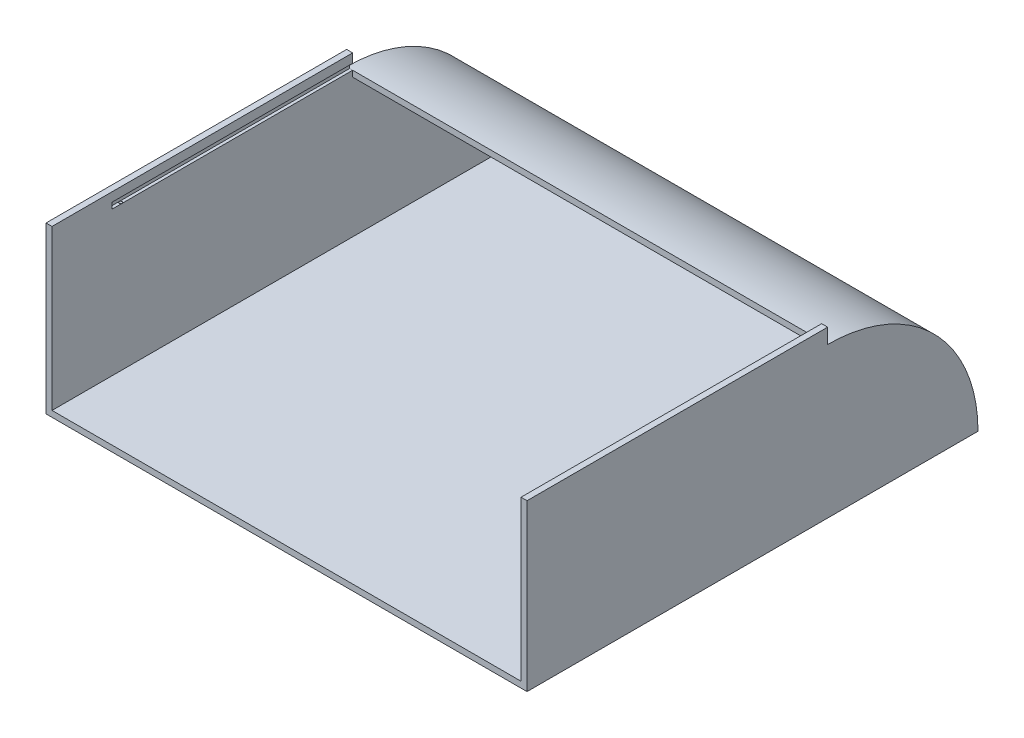
ISO-10303-21;
HEADER;
FILE_DESCRIPTION(('STEP AP214'),'2;1');
FILE_NAME('part.step','',(''),(''),'','','');
FILE_SCHEMA(('AUTOMOTIVE_DESIGN { 1 0 10303 214 1 1 1 1 }'));
ENDSEC;
DATA;
#1=APPLICATION_CONTEXT('core data for automotive mechanical design processes');
#2=APPLICATION_PROTOCOL_DEFINITION('international standard','automotive_design',2000,#1);
#3=PRODUCT_CONTEXT('',#1,'mechanical');
#4=PRODUCT('Part','Part','',(#3));
#5=PRODUCT_RELATED_PRODUCT_CATEGORY('part','',(#4));
#6=PRODUCT_DEFINITION_FORMATION('','',#4);
#7=PRODUCT_DEFINITION_CONTEXT('part definition',#1,'design');
#8=PRODUCT_DEFINITION('design','',#6,#7);
#9=PRODUCT_DEFINITION_SHAPE('','',#8);
#10=(LENGTH_UNIT() NAMED_UNIT(*) SI_UNIT(.MILLI.,.METRE.));
#11=(NAMED_UNIT(*) PLANE_ANGLE_UNIT() SI_UNIT($,.RADIAN.));
#12=(NAMED_UNIT(*) SI_UNIT($,.STERADIAN.) SOLID_ANGLE_UNIT());
#13=UNCERTAINTY_MEASURE_WITH_UNIT(LENGTH_MEASURE(1.E-05),#10,'distance_accuracy_value','');
#14=(GEOMETRIC_REPRESENTATION_CONTEXT(3) GLOBAL_UNCERTAINTY_ASSIGNED_CONTEXT((#13)) GLOBAL_UNIT_ASSIGNED_CONTEXT((#10,
#11,#12)) REPRESENTATION_CONTEXT('',''));
#15=CARTESIAN_POINT('',(0.,0.,0.));
#16=DIRECTION('',(0.,0.,1.));
#17=DIRECTION('',(1.,0.,0.));
#18=AXIS2_PLACEMENT_3D('',#15,#16,#17);
#19=CARTESIAN_POINT('',(-159.,25.,-25.));
#20=DIRECTION('',(0.,-1.,0.));
#21=DIRECTION('',(0.,0.,-1.));
#22=AXIS2_PLACEMENT_3D('',#19,#20,#21);
#23=PLANE('',#22);
#24=CARTESIAN_POINT('',(-158.5,25.,51.6763529111586));
#25=DIRECTION('',(0.,-1.,0.));
#26=DIRECTION('',(0.,0.,-1.));
#27=AXIS2_PLACEMENT_3D('',#24,#25,#26);
#28=CIRCLE('',#27,0.5);
#29=CARTESIAN_POINT('',(-159.,25.,51.6763529111586));
#30=VERTEX_POINT('',#29);
#31=CARTESIAN_POINT('',(-158.,25.,51.6763529111586));
#32=VERTEX_POINT('',#31);
#33=EDGE_CURVE('E11',#30,#32,#28,.F.);
#34=ORIENTED_EDGE('',*,*,#33,.F.);
#35=DIRECTION('',(0.,0.,-1.));
#36=VECTOR('',#35,1.);
#37=CARTESIAN_POINT('',(-159.,25.,-25.));
#38=LINE('',#37,#36);
#39=CARTESIAN_POINT('',(-159.,25.,55.));
#40=VERTEX_POINT('',#39);
#41=EDGE_CURVE('E173',#40,#30,#38,.T.);
#42=ORIENTED_EDGE('',*,*,#41,.F.);
#43=DIRECTION('',(1.,0.,0.));
#44=VECTOR('',#43,1.);
#45=CARTESIAN_POINT('',(-159.,25.,55.));
#46=LINE('',#45,#44);
#47=CARTESIAN_POINT('',(-158.,25.,55.));
#48=VERTEX_POINT('',#47);
#49=EDGE_CURVE('E206',#40,#48,#46,.T.);
#50=ORIENTED_EDGE('',*,*,#49,.T.);
#51=DIRECTION('',(0.,0.,-1.));
#52=VECTOR('',#51,1.);
#53=CARTESIAN_POINT('',(-158.,25.,-25.));
#54=LINE('',#53,#52);
#55=EDGE_CURVE('E175',#48,#32,#54,.T.);
#56=ORIENTED_EDGE('',*,*,#55,.T.);
#57=EDGE_LOOP('',(#34,#42,#50,#56));
#58=FACE_BOUND('',#57,.T.);
#59=ADVANCED_FACE('F33',(#58),#23,.F.);
#60=CARTESIAN_POINT('',(-1.,25.,-25.));
#61=DIRECTION('',(0.,-1.,0.));
#62=DIRECTION('',(0.,0.,-1.));
#63=AXIS2_PLACEMENT_3D('',#60,#61,#62);
#64=PLANE('',#63);
#65=DIRECTION('',(0.,0.,1.));
#66=VECTOR('',#65,1.);
#67=CARTESIAN_POINT('',(-1.,25.,-25.));
#68=LINE('',#67,#66);
#69=CARTESIAN_POINT('',(-1.,25.,50.));
#70=VERTEX_POINT('',#69);
#71=CARTESIAN_POINT('',(-1.,25.,55.));
#72=VERTEX_POINT('',#71);
#73=EDGE_CURVE('E308',#70,#72,#68,.T.);
#74=ORIENTED_EDGE('',*,*,#73,.F.);
#75=CARTESIAN_POINT('',(-1.5,25.,50.));
#76=DIRECTION('',(0.,-1.,0.));
#77=DIRECTION('',(0.,0.,-1.));
#78=AXIS2_PLACEMENT_3D('',#75,#76,#77);
#79=CIRCLE('',#78,0.500000000000002);
#80=CARTESIAN_POINT('',(-2.,25.,50.));
#81=VERTEX_POINT('',#80);
#82=EDGE_CURVE('E52',#70,#81,#79,.T.);
#83=ORIENTED_EDGE('',*,*,#82,.T.);
#84=DIRECTION('',(0.,0.,1.));
#85=VECTOR('',#84,1.);
#86=CARTESIAN_POINT('',(-2.,25.,-25.));
#87=LINE('',#86,#85);
#88=CARTESIAN_POINT('',(-2.,25.,55.));
#89=VERTEX_POINT('',#88);
#90=EDGE_CURVE('E306',#81,#89,#87,.T.);
#91=ORIENTED_EDGE('',*,*,#90,.T.);
#92=DIRECTION('',(-1.,0.,0.));
#93=VECTOR('',#92,1.);
#94=CARTESIAN_POINT('',(-1.,25.,55.));
#95=LINE('',#94,#93);
#96=EDGE_CURVE('E334',#72,#89,#95,.T.);
#97=ORIENTED_EDGE('',*,*,#96,.F.);
#98=EDGE_LOOP('',(#74,#83,#91,#97));
#99=FACE_BOUND('',#98,.T.);
#100=ADVANCED_FACE('F304',(#99),#64,.F.);
#101=CARTESIAN_POINT('',(-160.,-25.,75.));
#102=DIRECTION('',(0.,0.,1.));
#103=DIRECTION('',(1.,0.,0.));
#104=AXIS2_PLACEMENT_3D('',#101,#102,#103);
#105=PLANE('',#104);
#106=DIRECTION('',(0.,-1.,0.));
#107=VECTOR('',#106,1.);
#108=CARTESIAN_POINT('',(0.,-25.,75.));
#109=LINE('',#108,#107);
#110=CARTESIAN_POINT('',(0.,30.,75.));
#111=VERTEX_POINT('',#110);
#112=CARTESIAN_POINT('',(0.,-25.,75.));
#113=VERTEX_POINT('',#112);
#114=EDGE_CURVE('E256',#111,#113,#109,.T.);
#115=ORIENTED_EDGE('',*,*,#114,.F.);
#116=DIRECTION('',(1.,0.,0.));
#117=VECTOR('',#116,1.);
#118=CARTESIAN_POINT('',(-2.,30.,75.));
#119=LINE('',#118,#117);
#120=CARTESIAN_POINT('',(-2.,30.,75.));
#121=VERTEX_POINT('',#120);
#122=EDGE_CURVE('E212',#121,#111,#119,.T.);
#123=ORIENTED_EDGE('',*,*,#122,.F.);
#124=DIRECTION('',(0.,-1.,0.));
#125=VECTOR('',#124,1.);
#126=CARTESIAN_POINT('',(-2.,0.,75.));
#127=LINE('',#126,#125);
#128=CARTESIAN_POINT('',(-2.,-23.,75.));
#129=VERTEX_POINT('',#128);
#130=EDGE_CURVE('E247',#121,#129,#127,.T.);
#131=ORIENTED_EDGE('',*,*,#130,.T.);
#132=DIRECTION('',(1.,0.,0.));
#133=VECTOR('',#132,1.);
#134=CARTESIAN_POINT('',(-160.,-23.,75.));
#135=LINE('',#134,#133);
#136=CARTESIAN_POINT('',(-158.,-23.,75.));
#137=VERTEX_POINT('',#136);
#138=EDGE_CURVE('E260',#137,#129,#135,.T.);
#139=ORIENTED_EDGE('',*,*,#138,.F.);
#140=DIRECTION('',(0.,-1.,0.));
#141=VECTOR('',#140,1.);
#142=CARTESIAN_POINT('',(-158.,0.,75.));
#143=LINE('',#142,#141);
#144=CARTESIAN_POINT('',(-158.,30.,75.));
#145=VERTEX_POINT('',#144);
#146=EDGE_CURVE('E261',#145,#137,#143,.T.);
#147=ORIENTED_EDGE('',*,*,#146,.F.);
#148=DIRECTION('',(1.,0.,0.));
#149=VECTOR('',#148,1.);
#150=CARTESIAN_POINT('',(-160.,30.,75.));
#151=LINE('',#150,#149);
#152=CARTESIAN_POINT('',(-160.,30.,75.));
#153=VERTEX_POINT('',#152);
#154=EDGE_CURVE('E227',#153,#145,#151,.T.);
#155=ORIENTED_EDGE('',*,*,#154,.F.);
#156=DIRECTION('',(0.,-1.,0.));
#157=VECTOR('',#156,1.);
#158=CARTESIAN_POINT('',(-160.,-25.,75.));
#159=LINE('',#158,#157);
#160=CARTESIAN_POINT('',(-160.,-25.,75.));
#161=VERTEX_POINT('',#160);
#162=EDGE_CURVE('E274',#153,#161,#159,.T.);
#163=ORIENTED_EDGE('',*,*,#162,.T.);
#164=DIRECTION('',(1.,0.,0.));
#165=VECTOR('',#164,1.);
#166=CARTESIAN_POINT('',(-160.,-25.,75.));
#167=LINE('',#166,#165);
#168=EDGE_CURVE('E281',#161,#113,#167,.T.);
#169=ORIENTED_EDGE('',*,*,#168,.T.);
#170=EDGE_LOOP('',(#115,#123,#131,#139,#147,#155,#163,#169));
#171=FACE_BOUND('',#170,.T.);
#172=ADVANCED_FACE('F374',(#171),#105,.T.);
#173=CARTESIAN_POINT('',(-160.,-25.,-75.));
#174=DIRECTION('',(0.,-1.,0.));
#175=DIRECTION('',(0.,0.,-1.));
#176=AXIS2_PLACEMENT_3D('',#173,#174,#175);
#177=PLANE('',#176);
#178=DIRECTION('',(0.,0.,-1.));
#179=VECTOR('',#178,1.);
#180=CARTESIAN_POINT('',(0.,-25.,-75.));
#181=LINE('',#180,#179);
#182=CARTESIAN_POINT('',(0.,-25.,-75.));
#183=VERTEX_POINT('',#182);
#184=EDGE_CURVE('E278',#113,#183,#181,.T.);
#185=ORIENTED_EDGE('',*,*,#184,.F.);
#186=ORIENTED_EDGE('',*,*,#168,.F.);
#187=DIRECTION('',(0.,0.,-1.));
#188=VECTOR('',#187,1.);
#189=CARTESIAN_POINT('',(-160.,-25.,-75.));
#190=LINE('',#189,#188);
#191=CARTESIAN_POINT('',(-160.,-25.,-75.));
#192=VERTEX_POINT('',#191);
#193=EDGE_CURVE('E277',#161,#192,#190,.T.);
#194=ORIENTED_EDGE('',*,*,#193,.T.);
#195=DIRECTION('',(1.,0.,0.));
#196=VECTOR('',#195,1.);
#197=CARTESIAN_POINT('',(-160.,-25.,-75.));
#198=LINE('',#197,#196);
#199=EDGE_CURVE('E286',#192,#183,#198,.T.);
#200=ORIENTED_EDGE('',*,*,#199,.T.);
#201=EDGE_LOOP('',(#185,#186,#194,#200));
#202=FACE_BOUND('',#201,.T.);
#203=ADVANCED_FACE('F367',(#202),#177,.T.);
#204=CARTESIAN_POINT('',(-160.,0.,0.));
#205=DIRECTION('',(1.,0.,0.));
#206=DIRECTION('',(0.,0.,-1.));
#207=AXIS2_PLACEMENT_3D('',#204,#205,#206);
#208=PLANE('',#207);
#209=ORIENTED_EDGE('',*,*,#162,.F.);
#210=DIRECTION('',(0.,0.,1.));
#211=VECTOR('',#210,1.);
#212=CARTESIAN_POINT('',(-160.,30.,-25.));
#213=LINE('',#212,#211);
#214=CARTESIAN_POINT('',(-160.,30.,-25.));
#215=VERTEX_POINT('',#214);
#216=EDGE_CURVE('E224',#215,#153,#213,.T.);
#217=ORIENTED_EDGE('',*,*,#216,.F.);
#218=DIRECTION('',(0.,-1.,0.));
#219=VECTOR('',#218,1.);
#220=CARTESIAN_POINT('',(-160.,30.,-25.));
#221=LINE('',#220,#219);
#222=CARTESIAN_POINT('',(-160.,25.,-25.));
#223=VERTEX_POINT('',#222);
#224=EDGE_CURVE('E234',#215,#223,#221,.T.);
#225=ORIENTED_EDGE('',*,*,#224,.T.);
#226=CARTESIAN_POINT('',(-160.,-25.,-25.));
#227=DIRECTION('',(1.,0.,0.));
#228=DIRECTION('',(0.,0.,-1.));
#229=AXIS2_PLACEMENT_3D('',#226,#227,#228);
#230=CIRCLE('',#229,50.);
#231=EDGE_CURVE('E297',#223,#192,#230,.F.);
#232=ORIENTED_EDGE('',*,*,#231,.T.);
#233=ORIENTED_EDGE('',*,*,#193,.F.);
#234=EDGE_LOOP('',(#209,#217,#225,#232,#233));
#235=FACE_BOUND('',#234,.T.);
#236=ADVANCED_FACE('F361',(#235),#208,.F.);
#237=CARTESIAN_POINT('',(0.,0.,0.));
#238=DIRECTION('',(1.,0.,0.));
#239=DIRECTION('',(0.,0.,-1.));
#240=AXIS2_PLACEMENT_3D('',#237,#238,#239);
#241=PLANE('',#240);
#242=ORIENTED_EDGE('',*,*,#184,.T.);
#243=CARTESIAN_POINT('',(0.,-25.,-25.));
#244=DIRECTION('',(1.,0.,0.));
#245=DIRECTION('',(0.,0.,-1.));
#246=AXIS2_PLACEMENT_3D('',#243,#244,#245);
#247=CIRCLE('',#246,50.);
#248=CARTESIAN_POINT('',(0.,25.,-25.));
#249=VERTEX_POINT('',#248);
#250=EDGE_CURVE('E289',#183,#249,#247,.T.);
#251=ORIENTED_EDGE('',*,*,#250,.T.);
#252=DIRECTION('',(0.,-1.,0.));
#253=VECTOR('',#252,1.);
#254=CARTESIAN_POINT('',(0.,30.,-25.));
#255=LINE('',#254,#253);
#256=CARTESIAN_POINT('',(0.,30.,-25.));
#257=VERTEX_POINT('',#256);
#258=EDGE_CURVE('E222',#257,#249,#255,.T.);
#259=ORIENTED_EDGE('',*,*,#258,.F.);
#260=DIRECTION('',(0.,0.,-1.));
#261=VECTOR('',#260,1.);
#262=CARTESIAN_POINT('',(0.,30.,-25.));
#263=LINE('',#262,#261);
#264=EDGE_CURVE('E215',#111,#257,#263,.T.);
#265=ORIENTED_EDGE('',*,*,#264,.F.);
#266=ORIENTED_EDGE('',*,*,#114,.T.);
#267=EDGE_LOOP('',(#242,#251,#259,#265,#266));
#268=FACE_BOUND('',#267,.T.);
#269=ADVANCED_FACE('F369',(#268),#241,.T.);
#270=CARTESIAN_POINT('',(-160.,-25.,-25.));
#271=DIRECTION('',(1.,0.,0.));
#272=DIRECTION('',(0.,0.,-1.));
#273=AXIS2_PLACEMENT_3D('',#270,#271,#272);
#274=CYLINDRICAL_SURFACE('',#273,50.);
#275=ORIENTED_EDGE('',*,*,#231,.F.);
#276=DIRECTION('',(1.,0.,0.));
#277=VECTOR('',#276,1.);
#278=CARTESIAN_POINT('',(-160.,25.,-25.));
#279=LINE('',#278,#277);
#280=CARTESIAN_POINT('',(-159.,25.,-25.));
#281=VERTEX_POINT('',#280);
#282=EDGE_CURVE('E293',#281,#223,#279,.F.);
#283=ORIENTED_EDGE('',*,*,#282,.F.);
#284=CARTESIAN_POINT('',(-158.,25.,-25.));
#285=VERTEX_POINT('',#284);
#286=EDGE_CURVE('E180',#285,#281,#279,.F.);
#287=ORIENTED_EDGE('',*,*,#286,.F.);
#288=DIRECTION('',(-1.,0.,0.));
#289=VECTOR('',#288,1.);
#290=CARTESIAN_POINT('',(-80.,25.,-25.));
#291=LINE('',#290,#289);
#292=CARTESIAN_POINT('',(-2.,25.,-25.));
#293=VERTEX_POINT('',#292);
#294=EDGE_CURVE('E240',#293,#285,#291,.T.);
#295=ORIENTED_EDGE('',*,*,#294,.F.);
#296=DIRECTION('',(-1.,0.,0.));
#297=VECTOR('',#296,1.);
#298=CARTESIAN_POINT('',(-1.,25.,-25.));
#299=LINE('',#298,#297);
#300=CARTESIAN_POINT('',(-1.,25.,-25.));
#301=VERTEX_POINT('',#300);
#302=EDGE_CURVE('E321',#301,#293,#299,.T.);
#303=ORIENTED_EDGE('',*,*,#302,.F.);
#304=EDGE_CURVE('E294',#249,#301,#279,.F.);
#305=ORIENTED_EDGE('',*,*,#304,.F.);
#306=ORIENTED_EDGE('',*,*,#250,.F.);
#307=ORIENTED_EDGE('',*,*,#199,.F.);
#308=EDGE_LOOP('',(#275,#283,#287,#295,#303,#305,#306,#307));
#309=FACE_BOUND('',#308,.T.);
#310=ADVANCED_FACE('F35',(#309),#274,.T.);
#311=CARTESIAN_POINT('',(-160.,-23.,-75.));
#312=DIRECTION('',(0.,-1.,0.));
#313=DIRECTION('',(0.,0.,-1.));
#314=AXIS2_PLACEMENT_3D('',#311,#312,#313);
#315=PLANE('',#314);
#316=DIRECTION('',(0.,0.,-1.));
#317=VECTOR('',#316,1.);
#318=CARTESIAN_POINT('',(-2.,-23.,0.));
#319=LINE('',#318,#317);
#320=CARTESIAN_POINT('',(-2.,-23.,-72.9583152331272));
#321=VERTEX_POINT('',#320);
#322=EDGE_CURVE('E262',#129,#321,#319,.T.);
#323=ORIENTED_EDGE('',*,*,#322,.T.);
#324=DIRECTION('',(1.,0.,0.));
#325=VECTOR('',#324,1.);
#326=CARTESIAN_POINT('',(-158.,-23.,-72.9583152331272));
#327=LINE('',#326,#325);
#328=CARTESIAN_POINT('',(-158.,-23.,-72.9583152331272));
#329=VERTEX_POINT('',#328);
#330=EDGE_CURVE('E265',#329,#321,#327,.T.);
#331=ORIENTED_EDGE('',*,*,#330,.F.);
#332=DIRECTION('',(0.,0.,-1.));
#333=VECTOR('',#332,1.);
#334=CARTESIAN_POINT('',(-158.,-23.,0.));
#335=LINE('',#334,#333);
#336=EDGE_CURVE('E257',#137,#329,#335,.T.);
#337=ORIENTED_EDGE('',*,*,#336,.F.);
#338=ORIENTED_EDGE('',*,*,#138,.T.);
#339=EDGE_LOOP('',(#323,#331,#337,#338));
#340=FACE_BOUND('',#339,.T.);
#341=ADVANCED_FACE('F385',(#340),#315,.F.);
#342=CARTESIAN_POINT('',(-158.,0.,0.));
#343=DIRECTION('',(1.,0.,0.));
#344=DIRECTION('',(0.,0.,-1.));
#345=AXIS2_PLACEMENT_3D('',#342,#343,#344);
#346=PLANE('',#345);
#347=ORIENTED_EDGE('',*,*,#55,.F.);
#348=DIRECTION('',(0.,-1.,0.));
#349=VECTOR('',#348,1.);
#350=CARTESIAN_POINT('',(-158.,25.,55.));
#351=LINE('',#350,#349);
#352=CARTESIAN_POINT('',(-158.,27.,55.));
#353=VERTEX_POINT('',#352);
#354=EDGE_CURVE('E199',#353,#48,#351,.T.);
#355=ORIENTED_EDGE('',*,*,#354,.F.);
#356=DIRECTION('',(0.,0.,1.));
#357=VECTOR('',#356,1.);
#358=CARTESIAN_POINT('',(-158.,27.,-25.));
#359=LINE('',#358,#357);
#360=CARTESIAN_POINT('',(-158.,27.,-25.));
#361=VERTEX_POINT('',#360);
#362=EDGE_CURVE('E196',#361,#353,#359,.T.);
#363=ORIENTED_EDGE('',*,*,#362,.F.);
#364=DIRECTION('',(0.,-1.,0.));
#365=VECTOR('',#364,1.);
#366=CARTESIAN_POINT('',(-158.,30.,-25.));
#367=LINE('',#366,#365);
#368=CARTESIAN_POINT('',(-158.,30.,-25.));
#369=VERTEX_POINT('',#368);
#370=EDGE_CURVE('E237',#369,#361,#367,.T.);
#371=ORIENTED_EDGE('',*,*,#370,.F.);
#372=DIRECTION('',(0.,0.,-1.));
#373=VECTOR('',#372,1.);
#374=CARTESIAN_POINT('',(-158.,30.,-25.));
#375=LINE('',#374,#373);
#376=EDGE_CURVE('E230',#145,#369,#375,.T.);
#377=ORIENTED_EDGE('',*,*,#376,.F.);
#378=ORIENTED_EDGE('',*,*,#146,.T.);
#379=ORIENTED_EDGE('',*,*,#336,.T.);
#380=CARTESIAN_POINT('',(-158.,-25.,-25.));
#381=DIRECTION('',(1.,0.,0.));
#382=DIRECTION('',(0.,0.,-1.));
#383=AXIS2_PLACEMENT_3D('',#380,#381,#382);
#384=CIRCLE('',#383,48.);
#385=CARTESIAN_POINT('',(-158.,23.,-25.));
#386=VERTEX_POINT('',#385);
#387=EDGE_CURVE('E253',#386,#329,#384,.F.);
#388=ORIENTED_EDGE('',*,*,#387,.F.);
#389=DIRECTION('',(0.,1.,0.));
#390=VECTOR('',#389,1.);
#391=CARTESIAN_POINT('',(-158.,23.,-25.));
#392=LINE('',#391,#390);
#393=EDGE_CURVE('E243',#386,#285,#392,.T.);
#394=ORIENTED_EDGE('',*,*,#393,.T.);
#395=EDGE_CURVE('E203',#32,#285,#54,.T.);
#396=ORIENTED_EDGE('',*,*,#395,.F.);
#397=EDGE_LOOP('',(#347,#355,#363,#371,#377,#378,#379,#388,#394,#396));
#398=FACE_BOUND('',#397,.T.);
#399=ADVANCED_FACE('F346',(#398),#346,.T.);
#400=CARTESIAN_POINT('',(-2.,0.,0.));
#401=DIRECTION('',(1.,0.,0.));
#402=DIRECTION('',(0.,0.,-1.));
#403=AXIS2_PLACEMENT_3D('',#400,#401,#402);
#404=PLANE('',#403);
#405=DIRECTION('',(0.,-1.,0.));
#406=VECTOR('',#405,1.);
#407=CARTESIAN_POINT('',(-2.,30.,-25.));
#408=LINE('',#407,#406);
#409=CARTESIAN_POINT('',(-2.,30.,-25.));
#410=VERTEX_POINT('',#409);
#411=CARTESIAN_POINT('',(-2.,27.,-25.));
#412=VERTEX_POINT('',#411);
#413=EDGE_CURVE('E219',#410,#412,#408,.T.);
#414=ORIENTED_EDGE('',*,*,#413,.T.);
#415=DIRECTION('',(0.,0.,-1.));
#416=VECTOR('',#415,1.);
#417=CARTESIAN_POINT('',(-2.,27.,-25.));
#418=LINE('',#417,#416);
#419=CARTESIAN_POINT('',(-2.,27.,55.));
#420=VERTEX_POINT('',#419);
#421=EDGE_CURVE('E322',#420,#412,#418,.T.);
#422=ORIENTED_EDGE('',*,*,#421,.F.);
#423=DIRECTION('',(0.,1.,0.));
#424=VECTOR('',#423,1.);
#425=CARTESIAN_POINT('',(-2.,25.,55.));
#426=LINE('',#425,#424);
#427=EDGE_CURVE('E317',#89,#420,#426,.T.);
#428=ORIENTED_EDGE('',*,*,#427,.F.);
#429=ORIENTED_EDGE('',*,*,#90,.F.);
#430=EDGE_CURVE('E314',#293,#81,#87,.T.);
#431=ORIENTED_EDGE('',*,*,#430,.F.);
#432=DIRECTION('',(0.,1.,0.));
#433=VECTOR('',#432,1.);
#434=CARTESIAN_POINT('',(-2.,23.,-25.));
#435=LINE('',#434,#433);
#436=CARTESIAN_POINT('',(-2.,23.,-25.));
#437=VERTEX_POINT('',#436);
#438=EDGE_CURVE('E244',#437,#293,#435,.T.);
#439=ORIENTED_EDGE('',*,*,#438,.F.);
#440=CARTESIAN_POINT('',(-2.,-25.,-25.));
#441=DIRECTION('',(1.,0.,0.));
#442=DIRECTION('',(0.,0.,-1.));
#443=AXIS2_PLACEMENT_3D('',#440,#441,#442);
#444=CIRCLE('',#443,48.);
#445=EDGE_CURVE('E254',#321,#437,#444,.T.);
#446=ORIENTED_EDGE('',*,*,#445,.F.);
#447=ORIENTED_EDGE('',*,*,#322,.F.);
#448=ORIENTED_EDGE('',*,*,#130,.F.);
#449=DIRECTION('',(0.,0.,1.));
#450=VECTOR('',#449,1.);
#451=CARTESIAN_POINT('',(-2.,30.,-25.));
#452=LINE('',#451,#450);
#453=EDGE_CURVE('E208',#410,#121,#452,.T.);
#454=ORIENTED_EDGE('',*,*,#453,.F.);
#455=EDGE_LOOP('',(#414,#422,#428,#429,#431,#439,#446,#447,#448,#454));
#456=FACE_BOUND('',#455,.T.);
#457=ADVANCED_FACE('F313',(#456),#404,.F.);
#458=CARTESIAN_POINT('',(-160.,-25.,-25.));
#459=DIRECTION('',(1.,0.,0.));
#460=DIRECTION('',(0.,0.,-1.));
#461=AXIS2_PLACEMENT_3D('',#458,#459,#460);
#462=CYLINDRICAL_SURFACE('',#461,48.);
#463=ORIENTED_EDGE('',*,*,#387,.T.);
#464=ORIENTED_EDGE('',*,*,#330,.T.);
#465=ORIENTED_EDGE('',*,*,#445,.T.);
#466=DIRECTION('',(1.,0.,0.));
#467=VECTOR('',#466,1.);
#468=CARTESIAN_POINT('',(-160.,23.,-25.));
#469=LINE('',#468,#467);
#470=EDGE_CURVE('E250',#437,#386,#469,.F.);
#471=ORIENTED_EDGE('',*,*,#470,.T.);
#472=EDGE_LOOP('',(#463,#464,#465,#471));
#473=FACE_BOUND('',#472,.T.);
#474=ADVANCED_FACE('F529',(#473),#462,.F.);
#475=CARTESIAN_POINT('',(-80.,23.,-25.));
#476=DIRECTION('',(0.,0.,-1.));
#477=DIRECTION('',(-1.,0.,0.));
#478=AXIS2_PLACEMENT_3D('',#475,#476,#477);
#479=PLANE('',#478);
#480=ORIENTED_EDGE('',*,*,#294,.T.);
#481=ORIENTED_EDGE('',*,*,#393,.F.);
#482=ORIENTED_EDGE('',*,*,#470,.F.);
#483=ORIENTED_EDGE('',*,*,#438,.T.);
#484=EDGE_LOOP('',(#480,#481,#482,#483));
#485=FACE_BOUND('',#484,.T.);
#486=ADVANCED_FACE('F351',(#485),#479,.F.);
#487=CARTESIAN_POINT('',(-160.,30.,-25.));
#488=DIRECTION('',(0.,0.,1.));
#489=DIRECTION('',(0.,-1.,0.));
#490=AXIS2_PLACEMENT_3D('',#487,#488,#489);
#491=PLANE('',#490);
#492=ORIENTED_EDGE('',*,*,#370,.T.);
#493=DIRECTION('',(1.,0.,0.));
#494=VECTOR('',#493,1.);
#495=CARTESIAN_POINT('',(-159.,27.,-25.));
#496=LINE('',#495,#494);
#497=CARTESIAN_POINT('',(-159.,27.,-25.));
#498=VERTEX_POINT('',#497);
#499=EDGE_CURVE('E190',#498,#361,#496,.T.);
#500=ORIENTED_EDGE('',*,*,#499,.F.);
#501=DIRECTION('',(0.,1.,0.));
#502=VECTOR('',#501,1.);
#503=CARTESIAN_POINT('',(-159.,25.,-25.));
#504=LINE('',#503,#502);
#505=EDGE_CURVE('E205',#281,#498,#504,.T.);
#506=ORIENTED_EDGE('',*,*,#505,.F.);
#507=ORIENTED_EDGE('',*,*,#282,.T.);
#508=ORIENTED_EDGE('',*,*,#224,.F.);
#509=DIRECTION('',(-1.,0.,0.));
#510=VECTOR('',#509,1.);
#511=CARTESIAN_POINT('',(-160.,30.,-25.));
#512=LINE('',#511,#510);
#513=EDGE_CURVE('E232',#369,#215,#512,.T.);
#514=ORIENTED_EDGE('',*,*,#513,.F.);
#515=EDGE_LOOP('',(#492,#500,#506,#507,#508,#514));
#516=FACE_BOUND('',#515,.T.);
#517=ADVANCED_FACE('F357',(#516),#491,.F.);
#518=CARTESIAN_POINT('',(0.,30.,0.));
#519=DIRECTION('',(0.,1.,0.));
#520=DIRECTION('',(0.,0.,1.));
#521=AXIS2_PLACEMENT_3D('',#518,#519,#520);
#522=PLANE('',#521);
#523=ORIENTED_EDGE('',*,*,#216,.T.);
#524=ORIENTED_EDGE('',*,*,#154,.T.);
#525=ORIENTED_EDGE('',*,*,#376,.T.);
#526=ORIENTED_EDGE('',*,*,#513,.T.);
#527=EDGE_LOOP('',(#523,#524,#525,#526));
#528=FACE_BOUND('',#527,.T.);
#529=ADVANCED_FACE('F390',(#528),#522,.T.);
#530=CARTESIAN_POINT('',(-2.,30.,-25.));
#531=DIRECTION('',(0.,0.,1.));
#532=DIRECTION('',(0.,-1.,0.));
#533=AXIS2_PLACEMENT_3D('',#530,#531,#532);
#534=PLANE('',#533);
#535=DIRECTION('',(0.,-1.,0.));
#536=VECTOR('',#535,1.);
#537=CARTESIAN_POINT('',(-1.,25.,-25.));
#538=LINE('',#537,#536);
#539=CARTESIAN_POINT('',(-1.,27.,-25.));
#540=VERTEX_POINT('',#539);
#541=EDGE_CURVE('E329',#540,#301,#538,.T.);
#542=ORIENTED_EDGE('',*,*,#541,.F.);
#543=DIRECTION('',(-1.,0.,0.));
#544=VECTOR('',#543,1.);
#545=CARTESIAN_POINT('',(-1.,27.,-25.));
#546=LINE('',#545,#544);
#547=EDGE_CURVE('E200',#540,#412,#546,.T.);
#548=ORIENTED_EDGE('',*,*,#547,.T.);
#549=ORIENTED_EDGE('',*,*,#413,.F.);
#550=DIRECTION('',(-1.,0.,0.));
#551=VECTOR('',#550,1.);
#552=CARTESIAN_POINT('',(-2.,30.,-25.));
#553=LINE('',#552,#551);
#554=EDGE_CURVE('E217',#257,#410,#553,.T.);
#555=ORIENTED_EDGE('',*,*,#554,.F.);
#556=ORIENTED_EDGE('',*,*,#258,.T.);
#557=ORIENTED_EDGE('',*,*,#304,.T.);
#558=EDGE_LOOP('',(#542,#548,#549,#555,#556,#557));
#559=FACE_BOUND('',#558,.T.);
#560=ADVANCED_FACE('F392',(#559),#534,.F.);
#561=CARTESIAN_POINT('',(0.,30.,0.));
#562=DIRECTION('',(0.,1.,0.));
#563=DIRECTION('',(0.,0.,1.));
#564=AXIS2_PLACEMENT_3D('',#561,#562,#563);
#565=PLANE('',#564);
#566=ORIENTED_EDGE('',*,*,#453,.T.);
#567=ORIENTED_EDGE('',*,*,#122,.T.);
#568=ORIENTED_EDGE('',*,*,#264,.T.);
#569=ORIENTED_EDGE('',*,*,#554,.T.);
#570=EDGE_LOOP('',(#566,#567,#568,#569));
#571=FACE_BOUND('',#570,.T.);
#572=ADVANCED_FACE('F376',(#571),#565,.T.);
#573=EDGE_CURVE('E37',#32,#30,#28,.F.);
#574=ORIENTED_EDGE('',*,*,#573,.F.);
#575=ORIENTED_EDGE('',*,*,#395,.T.);
#576=ORIENTED_EDGE('',*,*,#286,.T.);
#577=EDGE_CURVE('E177',#30,#281,#38,.T.);
#578=ORIENTED_EDGE('',*,*,#577,.F.);
#579=EDGE_LOOP('',(#574,#575,#576,#578));
#580=FACE_BOUND('',#579,.T.);
#581=ADVANCED_FACE('F178',(#580),#23,.F.);
#582=CARTESIAN_POINT('',(-159.,25.,55.));
#583=DIRECTION('',(0.,0.,1.));
#584=DIRECTION('',(1.,0.,0.));
#585=AXIS2_PLACEMENT_3D('',#582,#583,#584);
#586=PLANE('',#585);
#587=ORIENTED_EDGE('',*,*,#354,.T.);
#588=ORIENTED_EDGE('',*,*,#49,.F.);
#589=DIRECTION('',(0.,-1.,0.));
#590=VECTOR('',#589,1.);
#591=CARTESIAN_POINT('',(-159.,25.,55.));
#592=LINE('',#591,#590);
#593=CARTESIAN_POINT('',(-159.,27.,55.));
#594=VERTEX_POINT('',#593);
#595=EDGE_CURVE('E184',#594,#40,#592,.T.);
#596=ORIENTED_EDGE('',*,*,#595,.F.);
#597=DIRECTION('',(1.,0.,0.));
#598=VECTOR('',#597,1.);
#599=CARTESIAN_POINT('',(-159.,27.,55.));
#600=LINE('',#599,#598);
#601=EDGE_CURVE('E191',#594,#353,#600,.T.);
#602=ORIENTED_EDGE('',*,*,#601,.T.);
#603=EDGE_LOOP('',(#587,#588,#596,#602));
#604=FACE_BOUND('',#603,.T.);
#605=ADVANCED_FACE('F344',(#604),#586,.F.);
#606=CARTESIAN_POINT('',(-159.,27.,-25.));
#607=DIRECTION('',(0.,1.,0.));
#608=DIRECTION('',(0.,0.,1.));
#609=AXIS2_PLACEMENT_3D('',#606,#607,#608);
#610=PLANE('',#609);
#611=ORIENTED_EDGE('',*,*,#362,.T.);
#612=ORIENTED_EDGE('',*,*,#601,.F.);
#613=DIRECTION('',(0.,0.,1.));
#614=VECTOR('',#613,1.);
#615=CARTESIAN_POINT('',(-159.,27.,-25.));
#616=LINE('',#615,#614);
#617=EDGE_CURVE('E337',#498,#594,#616,.T.);
#618=ORIENTED_EDGE('',*,*,#617,.F.);
#619=ORIENTED_EDGE('',*,*,#499,.T.);
#620=EDGE_LOOP('',(#611,#612,#618,#619));
#621=FACE_BOUND('',#620,.T.);
#622=ADVANCED_FACE('F340',(#621),#610,.F.);
#623=CARTESIAN_POINT('',(-159.,0.,0.));
#624=DIRECTION('',(1.,0.,0.));
#625=DIRECTION('',(0.,0.,-1.));
#626=AXIS2_PLACEMENT_3D('',#623,#624,#625);
#627=PLANE('',#626);
#628=ORIENTED_EDGE('',*,*,#505,.T.);
#629=ORIENTED_EDGE('',*,*,#617,.T.);
#630=ORIENTED_EDGE('',*,*,#595,.T.);
#631=ORIENTED_EDGE('',*,*,#41,.T.);
#632=ORIENTED_EDGE('',*,*,#577,.T.);
#633=EDGE_LOOP('',(#628,#629,#630,#631,#632));
#634=FACE_BOUND('',#633,.T.);
#635=ADVANCED_FACE('F187',(#634),#627,.T.);
#636=CARTESIAN_POINT('',(-1.,27.,-25.));
#637=DIRECTION('',(0.,1.,0.));
#638=DIRECTION('',(0.,0.,1.));
#639=AXIS2_PLACEMENT_3D('',#636,#637,#638);
#640=PLANE('',#639);
#641=ORIENTED_EDGE('',*,*,#421,.T.);
#642=ORIENTED_EDGE('',*,*,#547,.F.);
#643=DIRECTION('',(0.,0.,-1.));
#644=VECTOR('',#643,1.);
#645=CARTESIAN_POINT('',(-1.,27.,-25.));
#646=LINE('',#645,#644);
#647=CARTESIAN_POINT('',(-1.,27.,55.));
#648=VERTEX_POINT('',#647);
#649=EDGE_CURVE('E325',#648,#540,#646,.T.);
#650=ORIENTED_EDGE('',*,*,#649,.F.);
#651=DIRECTION('',(-1.,0.,0.));
#652=VECTOR('',#651,1.);
#653=CARTESIAN_POINT('',(-1.,27.,55.));
#654=LINE('',#653,#652);
#655=EDGE_CURVE('E332',#648,#420,#654,.T.);
#656=ORIENTED_EDGE('',*,*,#655,.T.);
#657=EDGE_LOOP('',(#641,#642,#650,#656));
#658=FACE_BOUND('',#657,.T.);
#659=ADVANCED_FACE('F425',(#658),#640,.F.);
#660=CARTESIAN_POINT('',(-1.,25.,55.));
#661=DIRECTION('',(0.,0.,1.));
#662=DIRECTION('',(1.,0.,0.));
#663=AXIS2_PLACEMENT_3D('',#660,#661,#662);
#664=PLANE('',#663);
#665=ORIENTED_EDGE('',*,*,#427,.T.);
#666=ORIENTED_EDGE('',*,*,#655,.F.);
#667=DIRECTION('',(0.,1.,0.));
#668=VECTOR('',#667,1.);
#669=CARTESIAN_POINT('',(-1.,25.,55.));
#670=LINE('',#669,#668);
#671=EDGE_CURVE('E641',#72,#648,#670,.T.);
#672=ORIENTED_EDGE('',*,*,#671,.F.);
#673=ORIENTED_EDGE('',*,*,#96,.T.);
#674=EDGE_LOOP('',(#665,#666,#672,#673));
#675=FACE_BOUND('',#674,.T.);
#676=ADVANCED_FACE('F429',(#675),#664,.F.);
#677=ORIENTED_EDGE('',*,*,#430,.T.);
#678=EDGE_CURVE('E298',#81,#70,#79,.T.);
#679=ORIENTED_EDGE('',*,*,#678,.T.);
#680=EDGE_CURVE('E635',#301,#70,#68,.T.);
#681=ORIENTED_EDGE('',*,*,#680,.F.);
#682=ORIENTED_EDGE('',*,*,#302,.T.);
#683=EDGE_LOOP('',(#677,#679,#681,#682));
#684=FACE_BOUND('',#683,.T.);
#685=ADVANCED_FACE('F319',(#684),#64,.F.);
#686=CARTESIAN_POINT('',(-1.,0.,0.));
#687=DIRECTION('',(1.,0.,0.));
#688=DIRECTION('',(0.,0.,-1.));
#689=AXIS2_PLACEMENT_3D('',#686,#687,#688);
#690=PLANE('',#689);
#691=ORIENTED_EDGE('',*,*,#541,.T.);
#692=ORIENTED_EDGE('',*,*,#680,.T.);
#693=ORIENTED_EDGE('',*,*,#73,.T.);
#694=ORIENTED_EDGE('',*,*,#671,.T.);
#695=ORIENTED_EDGE('',*,*,#649,.T.);
#696=EDGE_LOOP('',(#691,#692,#693,#694,#695));
#697=FACE_BOUND('',#696,.T.);
#698=ADVANCED_FACE('F434',(#697),#690,.F.);
#699=CARTESIAN_POINT('',(-1.5,25.,50.));
#700=DIRECTION('',(0.0494806022490944,0.,0.9987750847919));
#701=DIRECTION('',(-0.9987750847919,0.,0.0494806022490944));
#702=AXIS2_PLACEMENT_3D('',#699,#700,#701);
#703=SPHERICAL_SURFACE('',#702,0.500000000000002);
#704=CARTESIAN_POINT('',(-1.5,25.,50.));
#705=DIRECTION('',(0.,-1.,0.));
#706=DIRECTION('',(0.,0.,-1.));
#707=AXIS2_PLACEMENT_3D('',#704,#705,#706);
#708=SPHERICAL_SURFACE('',#707,0.500000000000002);
#709=ORIENTED_EDGE('',*,*,#678,.F.);
#710=ORIENTED_EDGE('',*,*,#82,.F.);
#711=EDGE_LOOP('',(#709,#710));
#712=FACE_BOUND('',#711,.T.);
#713=ADVANCED_FACE('F440',(#712),#708,.F.);
#714=CARTESIAN_POINT('',(-158.5,25.,51.6763529111586));
#715=DIRECTION('',(1.,0.,0.));
#716=DIRECTION('',(0.,0.,1.));
#717=AXIS2_PLACEMENT_3D('',#714,#715,#716);
#718=SPHERICAL_SURFACE('',#717,0.5);
#719=CARTESIAN_POINT('',(-158.5,25.,51.6763529111586));
#720=DIRECTION('',(0.,-1.,0.));
#721=DIRECTION('',(0.,0.,-1.));
#722=AXIS2_PLACEMENT_3D('',#719,#720,#721);
#723=SPHERICAL_SURFACE('',#722,0.5);
#724=ORIENTED_EDGE('',*,*,#33,.T.);
#725=ORIENTED_EDGE('',*,*,#573,.T.);
#726=EDGE_LOOP('',(#724,#725));
#727=FACE_BOUND('',#726,.T.);
#728=ADVANCED_FACE('F165',(#727),#723,.F.);
#729=CLOSED_SHELL('',(#59,#100,#172,#203,#236,#269,#310,#341,#399,#457,#474,#486,#517,#529,#560,
#572,#581,#605,#622,#635,#659,#676,#685,#698,#713,#728));
#730=MANIFOLD_SOLID_BREP('B2',#729);
#731=ADVANCED_BREP_SHAPE_REPRESENTATION('',(#18,#730),#14);
#732=SHAPE_DEFINITION_REPRESENTATION(#9,#731);
ENDSEC;
END-ISO-10303-21;
